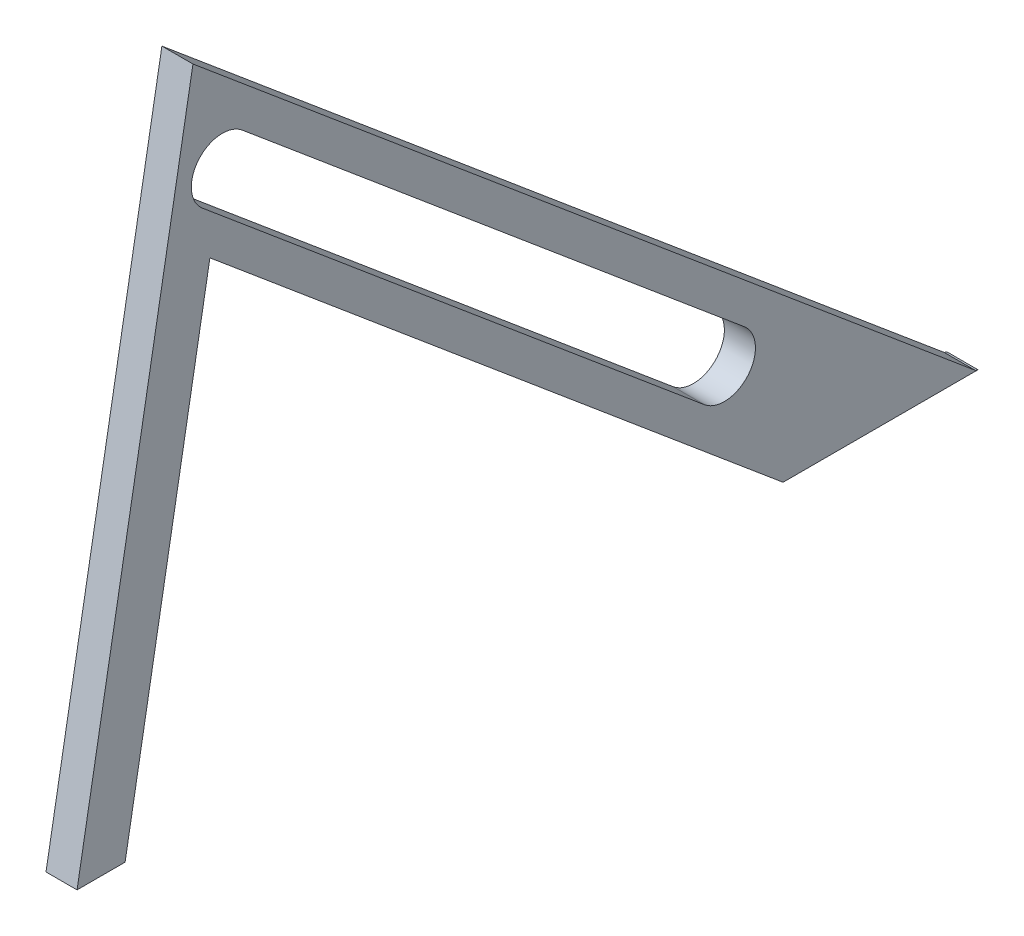
ISO-10303-21;
HEADER;
FILE_DESCRIPTION(('STEP AP214'),'2;1');
FILE_NAME('part.step','',(''),(''),'','','');
FILE_SCHEMA(('AUTOMOTIVE_DESIGN { 1 0 10303 214 1 1 1 1 }'));
ENDSEC;
DATA;
#1=APPLICATION_CONTEXT('core data for automotive mechanical design processes');
#2=APPLICATION_PROTOCOL_DEFINITION('international standard','automotive_design',2000,#1);
#3=PRODUCT_CONTEXT('',#1,'mechanical');
#4=PRODUCT('Part','Part','',(#3));
#5=PRODUCT_RELATED_PRODUCT_CATEGORY('part','',(#4));
#6=PRODUCT_DEFINITION_FORMATION('','',#4);
#7=PRODUCT_DEFINITION_CONTEXT('part definition',#1,'design');
#8=PRODUCT_DEFINITION('design','',#6,#7);
#9=PRODUCT_DEFINITION_SHAPE('','',#8);
#10=(LENGTH_UNIT() NAMED_UNIT(*) SI_UNIT(.MILLI.,.METRE.));
#11=(NAMED_UNIT(*) PLANE_ANGLE_UNIT() SI_UNIT($,.RADIAN.));
#12=(NAMED_UNIT(*) SI_UNIT($,.STERADIAN.) SOLID_ANGLE_UNIT());
#13=UNCERTAINTY_MEASURE_WITH_UNIT(LENGTH_MEASURE(1.E-05),#10,'distance_accuracy_value','');
#14=(GEOMETRIC_REPRESENTATION_CONTEXT(3) GLOBAL_UNCERTAINTY_ASSIGNED_CONTEXT((#13)) GLOBAL_UNIT_ASSIGNED_CONTEXT((#10,
#11,#12)) REPRESENTATION_CONTEXT('',''));
#15=CARTESIAN_POINT('',(0.,0.,0.));
#16=DIRECTION('',(0.,0.,1.));
#17=DIRECTION('',(1.,0.,0.));
#18=AXIS2_PLACEMENT_3D('',#15,#16,#17);
#19=CARTESIAN_POINT('',(12.7,0.,0.));
#20=DIRECTION('',(-1.,0.,0.));
#21=DIRECTION('',(0.,0.,1.));
#22=AXIS2_PLACEMENT_3D('',#19,#20,#21);
#23=PLANE('',#22);
#24=DIRECTION('',(0.,0.64278760968654,0.766044443118977));
#25=VECTOR('',#24,1.);
#26=CARTESIAN_POINT('',(12.7,268.859,397.092904293702));
#27=LINE('',#26,#25);
#28=CARTESIAN_POINT('',(12.7,0.335441487364641,77.0789887400877));
#29=VERTEX_POINT('',#28);
#30=CARTESIAN_POINT('',(12.7,268.859,397.092904293702));
#31=VERTEX_POINT('',#30);
#32=EDGE_CURVE('E156',#29,#31,#27,.T.);
#33=ORIENTED_EDGE('',*,*,#32,.T.);
#34=DIRECTION('',(0.,-0.984807753012207,0.173648177666934));
#35=VECTOR('',#34,1.);
#36=CARTESIAN_POINT('',(12.7,268.859,397.092904293702));
#37=LINE('',#36,#35);
#38=CARTESIAN_POINT('',(12.7,0.,444.5));
#39=VERTEX_POINT('',#38);
#40=EDGE_CURVE('E159',#31,#39,#37,.T.);
#41=ORIENTED_EDGE('',*,*,#40,.T.);
#42=DIRECTION('',(0.,0.,-1.));
#43=VECTOR('',#42,1.);
#44=CARTESIAN_POINT('',(12.7,0.,444.5));
#45=LINE('',#44,#43);
#46=CARTESIAN_POINT('',(12.7,0.,424.843977236597));
#47=VERTEX_POINT('',#46);
#48=EDGE_CURVE('E162',#39,#47,#45,.T.);
#49=ORIENTED_EDGE('',*,*,#48,.T.);
#50=DIRECTION('',(0.,0.984807753012207,-0.173648177666934));
#51=VECTOR('',#50,1.);
#52=CARTESIAN_POINT('',(12.7,196.723779974419,390.156267080151));
#53=LINE('',#52,#51);
#54=CARTESIAN_POINT('',(12.7,196.723779974419,390.156267080151));
#55=VERTEX_POINT('',#54);
#56=EDGE_CURVE('E164',#47,#55,#53,.T.);
#57=ORIENTED_EDGE('',*,*,#56,.T.);
#58=DIRECTION('',(0.,-0.64278760968654,-0.766044443118977));
#59=VECTOR('',#58,1.);
#60=CARTESIAN_POINT('',(12.7,95.6821630332382,269.739557088971));
#61=LINE('',#60,#59);
#62=CARTESIAN_POINT('',(12.7,0.,155.709995546925));
#63=VERTEX_POINT('',#62);
#64=EDGE_CURVE('E166',#55,#63,#61,.T.);
#65=ORIENTED_EDGE('',*,*,#64,.T.);
#66=DIRECTION('',(0.,0.,-1.));
#67=VECTOR('',#66,1.);
#68=CARTESIAN_POINT('',(12.7,0.,155.709995546925));
#69=LINE('',#68,#67);
#70=CARTESIAN_POINT('',(12.7,0.,75.9790779731299));
#71=VERTEX_POINT('',#70);
#72=EDGE_CURVE('E168',#63,#71,#69,.T.);
#73=ORIENTED_EDGE('',*,*,#72,.T.);
#74=DIRECTION('',(0.,0.291707585197906,0.956507545572959));
#75=VECTOR('',#74,1.);
#76=CARTESIAN_POINT('',(12.7,0.335441487364641,77.0789887400877));
#77=LINE('',#76,#75);
#78=EDGE_CURVE('E170',#71,#29,#77,.T.);
#79=ORIENTED_EDGE('',*,*,#78,.T.);
#80=EDGE_LOOP('',(#33,#41,#49,#57,#65,#73,#79));
#81=FACE_BOUND('',#80,.T.);
#82=CARTESIAN_POINT('',(12.7,225.607594256542,385.06327131644));
#83=DIRECTION('',(1.,0.,0.));
#84=DIRECTION('',(0.,0.,-1.));
#85=AXIS2_PLACEMENT_3D('',#82,#83,#84);
#86=CIRCLE('',#85,12.7);
#87=CARTESIAN_POINT('',(12.7,235.336358684153,376.899868673421));
#88=VERTEX_POINT('',#87);
#89=CARTESIAN_POINT('',(12.7,215.878829828931,393.226673959459));
#90=VERTEX_POINT('',#89);
#91=EDGE_CURVE('E120',#88,#90,#86,.T.);
#92=ORIENTED_EDGE('',*,*,#91,.F.);
#93=DIRECTION('',(0.,0.64278760968654,0.766044443118977));
#94=VECTOR('',#93,1.);
#95=CARTESIAN_POINT('',(12.7,235.336358684153,376.899868673421));
#96=LINE('',#95,#94);
#97=CARTESIAN_POINT('',(12.7,63.0306789284298,171.553955800151));
#98=VERTEX_POINT('',#97);
#99=EDGE_CURVE('E142',#98,#88,#96,.T.);
#100=ORIENTED_EDGE('',*,*,#99,.F.);
#101=CARTESIAN_POINT('',(12.7,53.3019145008188,179.71735844317));
#102=DIRECTION('',(1.,0.,0.));
#103=DIRECTION('',(0.,0.,-1.));
#104=AXIS2_PLACEMENT_3D('',#101,#102,#103);
#105=CIRCLE('',#104,12.6999999999999);
#106=CARTESIAN_POINT('',(12.7,43.5731500732078,187.880761086189));
#107=VERTEX_POINT('',#106);
#108=EDGE_CURVE('E140',#107,#98,#105,.T.);
#109=ORIENTED_EDGE('',*,*,#108,.F.);
#110=DIRECTION('',(0.,-0.64278760968654,-0.766044443118978));
#111=VECTOR('',#110,1.);
#112=CARTESIAN_POINT('',(12.7,215.878829828931,393.226673959459));
#113=LINE('',#112,#111);
#114=EDGE_CURVE('E128',#90,#107,#113,.T.);
#115=ORIENTED_EDGE('',*,*,#114,.F.);
#116=EDGE_LOOP('',(#92,#100,#109,#115));
#117=FACE_BOUND('',#116,.T.);
#118=ADVANCED_FACE('F37',(#81,#117),#23,.F.);
#119=CARTESIAN_POINT('',(0.,0.,0.));
#120=DIRECTION('',(-1.,0.,0.));
#121=DIRECTION('',(0.,0.,1.));
#122=AXIS2_PLACEMENT_3D('',#119,#120,#121);
#123=PLANE('',#122);
#124=DIRECTION('',(0.,0.64278760968654,0.766044443118977));
#125=VECTOR('',#124,1.);
#126=CARTESIAN_POINT('',(0.,268.859,397.092904293702));
#127=LINE('',#126,#125);
#128=CARTESIAN_POINT('',(0.,0.335441487364641,77.0789887400877));
#129=VERTEX_POINT('',#128);
#130=CARTESIAN_POINT('',(0.,268.859,397.092904293702));
#131=VERTEX_POINT('',#130);
#132=EDGE_CURVE('E136',#129,#131,#127,.T.);
#133=ORIENTED_EDGE('',*,*,#132,.F.);
#134=DIRECTION('',(0.,0.291707585197906,0.956507545572959));
#135=VECTOR('',#134,1.);
#136=CARTESIAN_POINT('',(0.,0.335441487364641,77.0789887400877));
#137=LINE('',#136,#135);
#138=CARTESIAN_POINT('',(0.,0.,75.9790779731299));
#139=VERTEX_POINT('',#138);
#140=EDGE_CURVE('E160',#139,#129,#137,.T.);
#141=ORIENTED_EDGE('',*,*,#140,.F.);
#142=DIRECTION('',(0.,0.,-1.));
#143=VECTOR('',#142,1.);
#144=CARTESIAN_POINT('',(0.,0.,155.709995546925));
#145=LINE('',#144,#143);
#146=CARTESIAN_POINT('',(0.,0.,155.709995546925));
#147=VERTEX_POINT('',#146);
#148=EDGE_CURVE('E184',#147,#139,#145,.T.);
#149=ORIENTED_EDGE('',*,*,#148,.F.);
#150=DIRECTION('',(0.,-0.64278760968654,-0.766044443118977));
#151=VECTOR('',#150,1.);
#152=CARTESIAN_POINT('',(0.,95.6821630332382,269.739557088971));
#153=LINE('',#152,#151);
#154=CARTESIAN_POINT('',(0.,196.723779974419,390.156267080151));
#155=VERTEX_POINT('',#154);
#156=EDGE_CURVE('E182',#155,#147,#153,.T.);
#157=ORIENTED_EDGE('',*,*,#156,.F.);
#158=DIRECTION('',(0.,0.984807753012207,-0.173648177666934));
#159=VECTOR('',#158,1.);
#160=CARTESIAN_POINT('',(0.,196.723779974419,390.156267080151));
#161=LINE('',#160,#159);
#162=CARTESIAN_POINT('',(0.,0.,424.843977236597));
#163=VERTEX_POINT('',#162);
#164=EDGE_CURVE('E179',#163,#155,#161,.T.);
#165=ORIENTED_EDGE('',*,*,#164,.F.);
#166=DIRECTION('',(0.,0.,-1.));
#167=VECTOR('',#166,1.);
#168=CARTESIAN_POINT('',(0.,0.,444.5));
#169=LINE('',#168,#167);
#170=CARTESIAN_POINT('',(0.,0.,444.5));
#171=VERTEX_POINT('',#170);
#172=EDGE_CURVE('E177',#171,#163,#169,.T.);
#173=ORIENTED_EDGE('',*,*,#172,.F.);
#174=DIRECTION('',(0.,-0.984807753012207,0.173648177666934));
#175=VECTOR('',#174,1.);
#176=CARTESIAN_POINT('',(0.,268.859,397.092904293702));
#177=LINE('',#176,#175);
#178=EDGE_CURVE('E175',#131,#171,#177,.T.);
#179=ORIENTED_EDGE('',*,*,#178,.F.);
#180=EDGE_LOOP('',(#133,#141,#149,#157,#165,#173,#179));
#181=FACE_BOUND('',#180,.T.);
#182=DIRECTION('',(0.,0.64278760968654,0.766044443118977));
#183=VECTOR('',#182,1.);
#184=CARTESIAN_POINT('',(0.,235.336358684153,376.899868673421));
#185=LINE('',#184,#183);
#186=CARTESIAN_POINT('',(0.,63.0306789284298,171.553955800151));
#187=VERTEX_POINT('',#186);
#188=CARTESIAN_POINT('',(0.,235.336358684153,376.899868673421));
#189=VERTEX_POINT('',#188);
#190=EDGE_CURVE('E129',#187,#189,#185,.T.);
#191=ORIENTED_EDGE('',*,*,#190,.T.);
#192=CARTESIAN_POINT('',(0.,225.607594256542,385.06327131644));
#193=DIRECTION('',(1.,0.,0.));
#194=DIRECTION('',(0.,0.,-1.));
#195=AXIS2_PLACEMENT_3D('',#192,#193,#194);
#196=CIRCLE('',#195,12.7);
#197=CARTESIAN_POINT('',(0.,215.878829828931,393.226673959459));
#198=VERTEX_POINT('',#197);
#199=EDGE_CURVE('E60',#189,#198,#196,.T.);
#200=ORIENTED_EDGE('',*,*,#199,.T.);
#201=DIRECTION('',(0.,-0.64278760968654,-0.766044443118978));
#202=VECTOR('',#201,1.);
#203=CARTESIAN_POINT('',(0.,215.878829828931,393.226673959459));
#204=LINE('',#203,#202);
#205=CARTESIAN_POINT('',(0.,43.5731500732078,187.880761086189));
#206=VERTEX_POINT('',#205);
#207=EDGE_CURVE('E135',#198,#206,#204,.T.);
#208=ORIENTED_EDGE('',*,*,#207,.T.);
#209=CARTESIAN_POINT('',(0.,53.3019145008188,179.71735844317));
#210=DIRECTION('',(1.,0.,0.));
#211=DIRECTION('',(0.,0.,-1.));
#212=AXIS2_PLACEMENT_3D('',#209,#210,#211);
#213=CIRCLE('',#212,12.6999999999999);
#214=EDGE_CURVE('E148',#206,#187,#213,.T.);
#215=ORIENTED_EDGE('',*,*,#214,.T.);
#216=EDGE_LOOP('',(#191,#200,#208,#215));
#217=FACE_BOUND('',#216,.T.);
#218=ADVANCED_FACE('F211',(#181,#217),#123,.T.);
#219=CARTESIAN_POINT('',(12.7,268.859,397.092904293702));
#220=DIRECTION('',(0.,-0.766044443118978,0.64278760968654));
#221=DIRECTION('',(0.,-0.64278760968654,-0.766044443118977));
#222=AXIS2_PLACEMENT_3D('',#219,#220,#221);
#223=PLANE('',#222);
#224=ORIENTED_EDGE('',*,*,#132,.T.);
#225=DIRECTION('',(-1.,0.,0.));
#226=VECTOR('',#225,1.);
#227=CARTESIAN_POINT('',(12.7,268.859,397.092904293702));
#228=LINE('',#227,#226);
#229=EDGE_CURVE('E11',#31,#131,#228,.T.);
#230=ORIENTED_EDGE('',*,*,#229,.F.);
#231=ORIENTED_EDGE('',*,*,#32,.F.);
#232=DIRECTION('',(-1.,0.,0.));
#233=VECTOR('',#232,1.);
#234=CARTESIAN_POINT('',(12.7,0.335441487364641,77.0789887400877));
#235=LINE('',#234,#233);
#236=EDGE_CURVE('E172',#29,#129,#235,.T.);
#237=ORIENTED_EDGE('',*,*,#236,.T.);
#238=EDGE_LOOP('',(#224,#230,#231,#237));
#239=FACE_BOUND('',#238,.T.);
#240=ADVANCED_FACE('F39',(#239),#223,.F.);
#241=CARTESIAN_POINT('',(12.7,268.859,397.092904293702));
#242=DIRECTION('',(0.,-0.173648177666934,-0.984807753012208));
#243=DIRECTION('',(0.,0.984807753012208,-0.173648177666934));
#244=AXIS2_PLACEMENT_3D('',#241,#242,#243);
#245=PLANE('',#244);
#246=ORIENTED_EDGE('',*,*,#178,.T.);
#247=DIRECTION('',(-1.,0.,0.));
#248=VECTOR('',#247,1.);
#249=CARTESIAN_POINT('',(12.7,0.,444.5));
#250=LINE('',#249,#248);
#251=EDGE_CURVE('E45',#39,#171,#250,.T.);
#252=ORIENTED_EDGE('',*,*,#251,.F.);
#253=ORIENTED_EDGE('',*,*,#40,.F.);
#254=ORIENTED_EDGE('',*,*,#229,.T.);
#255=EDGE_LOOP('',(#246,#252,#253,#254));
#256=FACE_BOUND('',#255,.T.);
#257=ADVANCED_FACE('F227',(#256),#245,.F.);
#258=CARTESIAN_POINT('',(12.7,0.,444.5));
#259=DIRECTION('',(0.,1.,0.));
#260=DIRECTION('',(0.,0.,1.));
#261=AXIS2_PLACEMENT_3D('',#258,#259,#260);
#262=PLANE('',#261);
#263=ORIENTED_EDGE('',*,*,#172,.T.);
#264=DIRECTION('',(-1.,0.,0.));
#265=VECTOR('',#264,1.);
#266=CARTESIAN_POINT('',(12.7,0.,424.843977236597));
#267=LINE('',#266,#265);
#268=EDGE_CURVE('E198',#47,#163,#267,.T.);
#269=ORIENTED_EDGE('',*,*,#268,.F.);
#270=ORIENTED_EDGE('',*,*,#48,.F.);
#271=ORIENTED_EDGE('',*,*,#251,.T.);
#272=EDGE_LOOP('',(#263,#269,#270,#271));
#273=FACE_BOUND('',#272,.T.);
#274=ADVANCED_FACE('F205',(#273),#262,.F.);
#275=CARTESIAN_POINT('',(12.7,196.723779974419,390.156267080151));
#276=DIRECTION('',(0.,0.173648177666934,0.984807753012207));
#277=DIRECTION('',(0.,-0.984807753012207,0.173648177666934));
#278=AXIS2_PLACEMENT_3D('',#275,#276,#277);
#279=PLANE('',#278);
#280=ORIENTED_EDGE('',*,*,#164,.T.);
#281=DIRECTION('',(-1.,0.,0.));
#282=VECTOR('',#281,1.);
#283=CARTESIAN_POINT('',(12.7,196.723779974419,390.156267080151));
#284=LINE('',#283,#282);
#285=EDGE_CURVE('E195',#55,#155,#284,.T.);
#286=ORIENTED_EDGE('',*,*,#285,.F.);
#287=ORIENTED_EDGE('',*,*,#56,.F.);
#288=ORIENTED_EDGE('',*,*,#268,.T.);
#289=EDGE_LOOP('',(#280,#286,#287,#288));
#290=FACE_BOUND('',#289,.T.);
#291=ADVANCED_FACE('F216',(#290),#279,.F.);
#292=CARTESIAN_POINT('',(12.7,95.6821630332382,269.739557088971));
#293=DIRECTION('',(0.,0.766044443118977,-0.64278760968654));
#294=DIRECTION('',(0.,0.64278760968654,0.766044443118977));
#295=AXIS2_PLACEMENT_3D('',#292,#293,#294);
#296=PLANE('',#295);
#297=ORIENTED_EDGE('',*,*,#156,.T.);
#298=DIRECTION('',(-1.,0.,0.));
#299=VECTOR('',#298,1.);
#300=CARTESIAN_POINT('',(12.7,0.,155.709995546925));
#301=LINE('',#300,#299);
#302=EDGE_CURVE('E192',#63,#147,#301,.T.);
#303=ORIENTED_EDGE('',*,*,#302,.F.);
#304=ORIENTED_EDGE('',*,*,#64,.F.);
#305=ORIENTED_EDGE('',*,*,#285,.T.);
#306=EDGE_LOOP('',(#297,#303,#304,#305));
#307=FACE_BOUND('',#306,.T.);
#308=ADVANCED_FACE('F220',(#307),#296,.F.);
#309=CARTESIAN_POINT('',(12.7,0.,155.709995546925));
#310=DIRECTION('',(0.,1.,0.));
#311=DIRECTION('',(0.,0.,1.));
#312=AXIS2_PLACEMENT_3D('',#309,#310,#311);
#313=PLANE('',#312);
#314=ORIENTED_EDGE('',*,*,#148,.T.);
#315=DIRECTION('',(-1.,0.,0.));
#316=VECTOR('',#315,1.);
#317=CARTESIAN_POINT('',(12.7,0.,75.9790779731299));
#318=LINE('',#317,#316);
#319=EDGE_CURVE('E189',#71,#139,#318,.T.);
#320=ORIENTED_EDGE('',*,*,#319,.F.);
#321=ORIENTED_EDGE('',*,*,#72,.F.);
#322=ORIENTED_EDGE('',*,*,#302,.T.);
#323=EDGE_LOOP('',(#314,#320,#321,#322));
#324=FACE_BOUND('',#323,.T.);
#325=ADVANCED_FACE('F235',(#324),#313,.F.);
#326=CARTESIAN_POINT('',(12.7,0.335441487364641,77.0789887400877));
#327=DIRECTION('',(0.,-0.956507545572959,0.291707585197906));
#328=DIRECTION('',(0.,-0.291707585197906,-0.956507545572959));
#329=AXIS2_PLACEMENT_3D('',#326,#327,#328);
#330=PLANE('',#329);
#331=ORIENTED_EDGE('',*,*,#140,.T.);
#332=ORIENTED_EDGE('',*,*,#236,.F.);
#333=ORIENTED_EDGE('',*,*,#78,.F.);
#334=ORIENTED_EDGE('',*,*,#319,.T.);
#335=EDGE_LOOP('',(#331,#332,#333,#334));
#336=FACE_BOUND('',#335,.T.);
#337=ADVANCED_FACE('F232',(#336),#330,.F.);
#338=CARTESIAN_POINT('',(12.7,225.607594256542,385.06327131644));
#339=DIRECTION('',(-1.,0.,0.));
#340=DIRECTION('',(0.,0.,1.));
#341=AXIS2_PLACEMENT_3D('',#338,#339,#340);
#342=CYLINDRICAL_SURFACE('',#341,12.7);
#343=ORIENTED_EDGE('',*,*,#199,.F.);
#344=DIRECTION('',(-1.,0.,0.));
#345=VECTOR('',#344,1.);
#346=CARTESIAN_POINT('',(12.7,235.336358684153,376.899868673421));
#347=LINE('',#346,#345);
#348=EDGE_CURVE('E124',#88,#189,#347,.T.);
#349=ORIENTED_EDGE('',*,*,#348,.F.);
#350=ORIENTED_EDGE('',*,*,#91,.T.);
#351=DIRECTION('',(-1.,0.,0.));
#352=VECTOR('',#351,1.);
#353=CARTESIAN_POINT('',(12.7,215.878829828931,393.226673959459));
#354=LINE('',#353,#352);
#355=EDGE_CURVE('E123',#90,#198,#354,.T.);
#356=ORIENTED_EDGE('',*,*,#355,.T.);
#357=EDGE_LOOP('',(#343,#349,#350,#356));
#358=FACE_BOUND('',#357,.T.);
#359=ADVANCED_FACE('F122',(#358),#342,.F.);
#360=CARTESIAN_POINT('',(12.7,215.878829828931,393.226673959459));
#361=DIRECTION('',(0.,0.766044443118978,-0.64278760968654));
#362=DIRECTION('',(0.,0.64278760968654,0.766044443118978));
#363=AXIS2_PLACEMENT_3D('',#360,#361,#362);
#364=PLANE('',#363);
#365=ORIENTED_EDGE('',*,*,#207,.F.);
#366=ORIENTED_EDGE('',*,*,#355,.F.);
#367=ORIENTED_EDGE('',*,*,#114,.T.);
#368=DIRECTION('',(-1.,0.,0.));
#369=VECTOR('',#368,1.);
#370=CARTESIAN_POINT('',(12.7,43.5731500732078,187.880761086189));
#371=LINE('',#370,#369);
#372=EDGE_CURVE('E137',#107,#206,#371,.T.);
#373=ORIENTED_EDGE('',*,*,#372,.T.);
#374=EDGE_LOOP('',(#365,#366,#367,#373));
#375=FACE_BOUND('',#374,.T.);
#376=ADVANCED_FACE('F132',(#375),#364,.T.);
#377=CARTESIAN_POINT('',(12.7,53.3019145008188,179.71735844317));
#378=DIRECTION('',(-1.,0.,0.));
#379=DIRECTION('',(0.,0.,1.));
#380=AXIS2_PLACEMENT_3D('',#377,#378,#379);
#381=CYLINDRICAL_SURFACE('',#380,12.6999999999999);
#382=ORIENTED_EDGE('',*,*,#214,.F.);
#383=ORIENTED_EDGE('',*,*,#372,.F.);
#384=ORIENTED_EDGE('',*,*,#108,.T.);
#385=DIRECTION('',(-1.,0.,0.));
#386=VECTOR('',#385,1.);
#387=CARTESIAN_POINT('',(12.7,63.0306789284298,171.553955800151));
#388=LINE('',#387,#386);
#389=EDGE_CURVE('E52',#98,#187,#388,.T.);
#390=ORIENTED_EDGE('',*,*,#389,.T.);
#391=EDGE_LOOP('',(#382,#383,#384,#390));
#392=FACE_BOUND('',#391,.T.);
#393=ADVANCED_FACE('F255',(#392),#381,.F.);
#394=CARTESIAN_POINT('',(12.7,235.336358684153,376.899868673421));
#395=DIRECTION('',(0.,-0.766044443118977,0.64278760968654));
#396=DIRECTION('',(0.,-0.64278760968654,-0.766044443118978));
#397=AXIS2_PLACEMENT_3D('',#394,#395,#396);
#398=PLANE('',#397);
#399=ORIENTED_EDGE('',*,*,#190,.F.);
#400=ORIENTED_EDGE('',*,*,#389,.F.);
#401=ORIENTED_EDGE('',*,*,#99,.T.);
#402=ORIENTED_EDGE('',*,*,#348,.T.);
#403=EDGE_LOOP('',(#399,#400,#401,#402));
#404=FACE_BOUND('',#403,.T.);
#405=ADVANCED_FACE('F258',(#404),#398,.T.);
#406=CLOSED_SHELL('',(#118,#218,#240,#257,#274,#291,#308,#325,#337,#359,#376,#393,#405));
#407=MANIFOLD_SOLID_BREP('B2',#406);
#408=ADVANCED_BREP_SHAPE_REPRESENTATION('',(#18,#407),#14);
#409=SHAPE_DEFINITION_REPRESENTATION(#9,#408);
ENDSEC;
END-ISO-10303-21;
